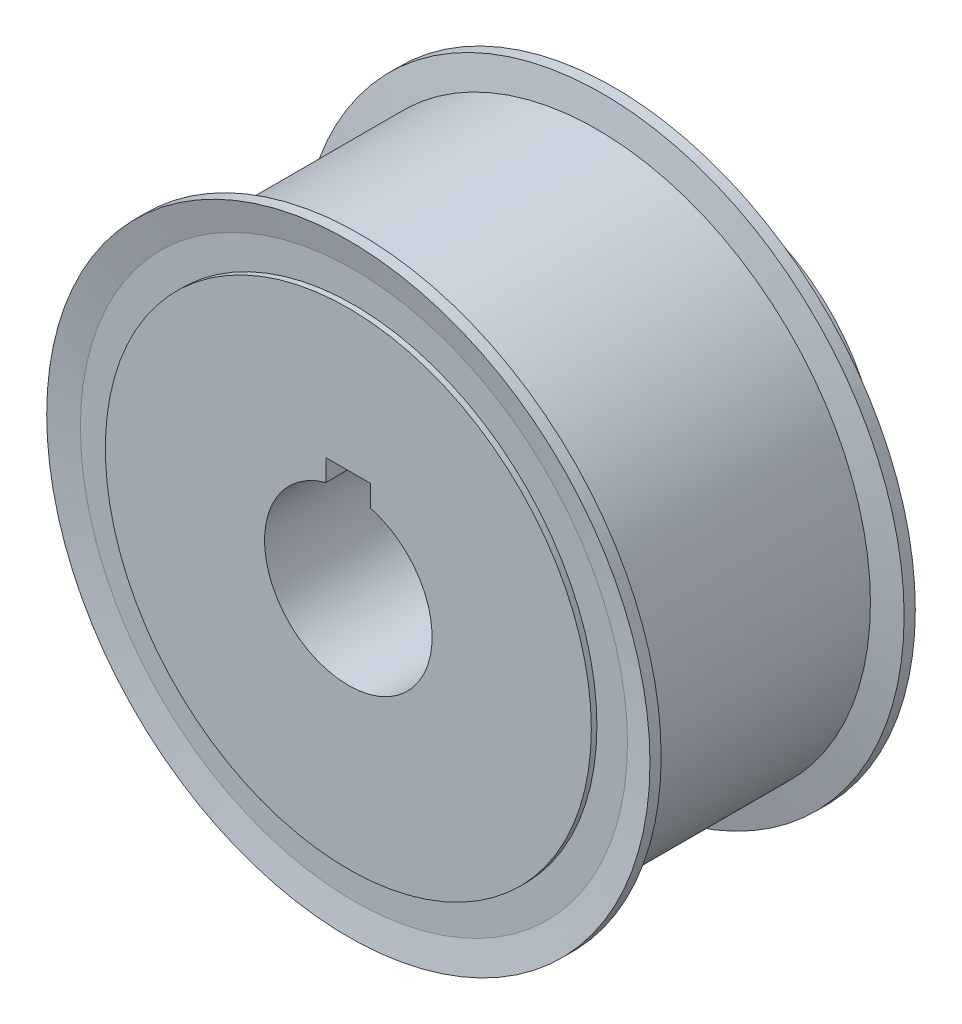
ISO-10303-21;
HEADER;
FILE_DESCRIPTION(('STEP AP214'),'2;1');
FILE_NAME('part.step','',(''),(''),'','','');
FILE_SCHEMA(('AUTOMOTIVE_DESIGN { 1 0 10303 214 1 1 1 1 }'));
ENDSEC;
DATA;
#1=APPLICATION_CONTEXT('core data for automotive mechanical design processes');
#2=APPLICATION_PROTOCOL_DEFINITION('international standard','automotive_design',2000,#1);
#3=PRODUCT_CONTEXT('',#1,'mechanical');
#4=PRODUCT('Part','Part','',(#3));
#5=PRODUCT_RELATED_PRODUCT_CATEGORY('part','',(#4));
#6=PRODUCT_DEFINITION_FORMATION('','',#4);
#7=PRODUCT_DEFINITION_CONTEXT('part definition',#1,'design');
#8=PRODUCT_DEFINITION('design','',#6,#7);
#9=PRODUCT_DEFINITION_SHAPE('','',#8);
#10=(LENGTH_UNIT() NAMED_UNIT(*) SI_UNIT(.MILLI.,.METRE.));
#11=(NAMED_UNIT(*) PLANE_ANGLE_UNIT() SI_UNIT($,.RADIAN.));
#12=(NAMED_UNIT(*) SI_UNIT($,.STERADIAN.) SOLID_ANGLE_UNIT());
#13=UNCERTAINTY_MEASURE_WITH_UNIT(LENGTH_MEASURE(1.E-05),#10,'distance_accuracy_value','');
#14=(GEOMETRIC_REPRESENTATION_CONTEXT(3) GLOBAL_UNCERTAINTY_ASSIGNED_CONTEXT((#13)) GLOBAL_UNIT_ASSIGNED_CONTEXT((#10,
#11,#12)) REPRESENTATION_CONTEXT('',''));
#15=CARTESIAN_POINT('',(0.,0.,0.));
#16=DIRECTION('',(0.,0.,1.));
#17=DIRECTION('',(1.,0.,0.));
#18=AXIS2_PLACEMENT_3D('',#15,#16,#17);
#19=CARTESIAN_POINT('',(0.,43.5,65.));
#20=DIRECTION('',(0.,0.,-1.));
#21=DIRECTION('',(-1.,0.,0.));
#22=AXIS2_PLACEMENT_3D('',#19,#20,#21);
#23=PLANE('',#22);
#24=CARTESIAN_POINT('',(0.,0.,65.));
#25=DIRECTION('',(0.,0.,-1.));
#26=DIRECTION('',(-1.,0.,0.));
#27=AXIS2_PLACEMENT_3D('',#24,#25,#26);
#28=CIRCLE('',#27,15.);
#29=CARTESIAN_POINT('',(4.,14.456832294801,65.));
#30=VERTEX_POINT('',#29);
#31=CARTESIAN_POINT('',(-4.,14.456832294801,65.));
#32=VERTEX_POINT('',#31);
#33=EDGE_CURVE('E97',#30,#32,#28,.T.);
#34=ORIENTED_EDGE('',*,*,#33,.T.);
#35=DIRECTION('',(0.,-1.,0.));
#36=VECTOR('',#35,1.);
#37=CARTESIAN_POINT('',(-4.,18.3,65.));
#38=LINE('',#37,#36);
#39=CARTESIAN_POINT('',(-4.,18.3,65.));
#40=VERTEX_POINT('',#39);
#41=EDGE_CURVE('E80',#40,#32,#38,.T.);
#42=ORIENTED_EDGE('',*,*,#41,.F.);
#43=DIRECTION('',(-1.,0.,0.));
#44=VECTOR('',#43,1.);
#45=CARTESIAN_POINT('',(-4.,18.3,65.));
#46=LINE('',#45,#44);
#47=CARTESIAN_POINT('',(4.,18.3,65.));
#48=VERTEX_POINT('',#47);
#49=EDGE_CURVE('E93',#48,#40,#46,.T.);
#50=ORIENTED_EDGE('',*,*,#49,.F.);
#51=DIRECTION('',(0.,1.,0.));
#52=VECTOR('',#51,1.);
#53=CARTESIAN_POINT('',(4.,18.3,65.));
#54=LINE('',#53,#52);
#55=EDGE_CURVE('E400',#30,#48,#54,.T.);
#56=ORIENTED_EDGE('',*,*,#55,.F.);
#57=EDGE_LOOP('',(#34,#42,#50,#56));
#58=FACE_BOUND('',#57,.T.);
#59=CARTESIAN_POINT('',(0.,0.,65.));
#60=DIRECTION('',(0.,0.,1.));
#61=DIRECTION('',(1.,0.,0.));
#62=AXIS2_PLACEMENT_3D('',#59,#60,#61);
#63=CIRCLE('',#62,43.5);
#64=CARTESIAN_POINT('',(43.5,0.,65.));
#65=VERTEX_POINT('',#64);
#66=EDGE_CURVE('E96',#65,#65,#63,.T.);
#67=ORIENTED_EDGE('',*,*,#66,.T.);
#68=EDGE_LOOP('',(#67));
#69=FACE_BOUND('',#68,.T.);
#70=ADVANCED_FACE('F34',(#58,#69),#23,.F.);
#71=CARTESIAN_POINT('',(0.,30.,0.));
#72=DIRECTION('',(0.,0.,1.));
#73=DIRECTION('',(1.,0.,0.));
#74=AXIS2_PLACEMENT_3D('',#71,#72,#73);
#75=PLANE('',#74);
#76=DIRECTION('',(-1.,0.,0.));
#77=VECTOR('',#76,1.);
#78=CARTESIAN_POINT('',(-4.,18.3,0.));
#79=LINE('',#78,#77);
#80=CARTESIAN_POINT('',(4.,18.3,0.));
#81=VERTEX_POINT('',#80);
#82=CARTESIAN_POINT('',(-4.,18.3,0.));
#83=VERTEX_POINT('',#82);
#84=EDGE_CURVE('E86',#81,#83,#79,.T.);
#85=ORIENTED_EDGE('',*,*,#84,.T.);
#86=DIRECTION('',(0.,-1.,0.));
#87=VECTOR('',#86,1.);
#88=CARTESIAN_POINT('',(-4.,18.3,0.));
#89=LINE('',#88,#87);
#90=CARTESIAN_POINT('',(-4.,14.456832294801,0.));
#91=VERTEX_POINT('',#90);
#92=EDGE_CURVE('E77',#83,#91,#89,.T.);
#93=ORIENTED_EDGE('',*,*,#92,.T.);
#94=CARTESIAN_POINT('',(0.,0.,0.));
#95=DIRECTION('',(0.,0.,-1.));
#96=DIRECTION('',(-1.,0.,0.));
#97=AXIS2_PLACEMENT_3D('',#94,#95,#96);
#98=CIRCLE('',#97,15.);
#99=CARTESIAN_POINT('',(4.,14.456832294801,0.));
#100=VERTEX_POINT('',#99);
#101=EDGE_CURVE('E92',#100,#91,#98,.T.);
#102=ORIENTED_EDGE('',*,*,#101,.F.);
#103=DIRECTION('',(0.,1.,0.));
#104=VECTOR('',#103,1.);
#105=CARTESIAN_POINT('',(4.,18.3,0.));
#106=LINE('',#105,#104);
#107=EDGE_CURVE('E48',#100,#81,#106,.T.);
#108=ORIENTED_EDGE('',*,*,#107,.T.);
#109=EDGE_LOOP('',(#85,#93,#102,#108));
#110=FACE_BOUND('',#109,.T.);
#111=CARTESIAN_POINT('',(0.,0.,0.));
#112=DIRECTION('',(0.,0.,1.));
#113=DIRECTION('',(1.,0.,0.));
#114=AXIS2_PLACEMENT_3D('',#111,#112,#113);
#115=CIRCLE('',#114,30.);
#116=CARTESIAN_POINT('',(30.,0.,0.));
#117=VERTEX_POINT('',#116);
#118=EDGE_CURVE('E11',#117,#117,#115,.T.);
#119=ORIENTED_EDGE('',*,*,#118,.F.);
#120=EDGE_LOOP('',(#119));
#121=FACE_BOUND('',#120,.T.);
#122=ADVANCED_FACE('F90',(#110,#121),#75,.F.);
#123=CARTESIAN_POINT('',(0.,0.,66.1429183979645));
#124=DIRECTION('',(0.,0.,1.));
#125=DIRECTION('',(1.,0.,0.));
#126=AXIS2_PLACEMENT_3D('',#123,#124,#125);
#127=CYLINDRICAL_SURFACE('',#126,30.);
#128=CARTESIAN_POINT('',(-24.6403939715099,-17.112889438338,8.));
#129=CARTESIAN_POINT('',(-24.6403982302135,-17.1128848269579,7.85983572802399));
#130=CARTESIAN_POINT('',(-24.6471704638801,-17.1031448928795,7.7195760346058));
#131=CARTESIAN_POINT('',(-24.6740153601059,-17.064392757025,7.44293744914142));
#132=CARTESIAN_POINT('',(-24.6941030931281,-17.035358718115,7.30656313718097));
#133=CARTESIAN_POINT('',(-24.7467822248692,-16.9587416374846,7.04174200968668));
#134=CARTESIAN_POINT('',(-24.7793665348156,-16.9111691116075,6.91329074761262));
#135=CARTESIAN_POINT('',(-24.85577810676,-16.7986575925144,6.66789201197522));
#136=CARTESIAN_POINT('',(-24.8996029650876,-16.7337223120106,6.5509420863624));
#137=CARTESIAN_POINT('',(-24.9969732573213,-16.5879175218532,6.33153499233339));
#138=CARTESIAN_POINT('',(-25.0505405914615,-16.5070120769735,6.22911142034259));
#139=CARTESIAN_POINT('',(-25.1653893889673,-16.3313858165926,6.04195308440494));
#140=CARTESIAN_POINT('',(-25.2266711891753,-16.2366643978055,5.95721909328104));
#141=CARTESIAN_POINT('',(-25.3549008499011,-16.0356855324758,5.80773346335955));
#142=CARTESIAN_POINT('',(-25.4218567742758,-15.9294116052125,5.74301089204638));
#143=CARTESIAN_POINT('',(-25.5591069750862,-15.708245311677,5.63557127220377));
#144=CARTESIAN_POINT('',(-25.629401193066,-15.5933530962965,5.59285383850449));
#145=CARTESIAN_POINT('',(-25.7709089460739,-15.3583531208021,5.53073379035992));
#146=CARTESIAN_POINT('',(-25.8421199433262,-15.2382582018677,5.51127682220139));
#147=CARTESIAN_POINT('',(-25.983473518509,-14.9959585455332,5.49606199203853));
#148=CARTESIAN_POINT('',(-26.0536161162836,-14.8737538474094,5.50030368932525));
#149=CARTESIAN_POINT('',(-26.1906866088721,-14.6310395402593,5.53232133044844));
#150=CARTESIAN_POINT('',(-26.2576220518945,-14.5105264763043,5.56003882451051));
#151=CARTESIAN_POINT('',(-26.3867358879054,-14.2743927889778,5.63813037740523));
#152=CARTESIAN_POINT('',(-26.4489142356258,-14.1587722121675,5.68850465180638));
#153=CARTESIAN_POINT('',(-26.567123329231,-13.9357069784381,5.81054496779643));
#154=CARTESIAN_POINT('',(-26.6231464003121,-13.8282725785832,5.88223718649691));
#155=CARTESIAN_POINT('',(-26.7277634622212,-13.6249679742124,6.04485930394655));
#156=CARTESIAN_POINT('',(-26.7763573023229,-13.5290980043274,6.13578959291404));
#157=CARTESIAN_POINT('',(-26.8653148537188,-13.3515829493876,6.33463609988813));
#158=CARTESIAN_POINT('',(-26.9056531003474,-13.2699819870085,6.44260310704702));
#159=CARTESIAN_POINT('',(-26.9772015087608,-13.1239184294215,6.67228126279082));
#160=CARTESIAN_POINT('',(-27.008411663021,-13.0594558483414,6.79399242270543));
#161=CARTESIAN_POINT('',(-27.0611983817954,-12.9497207938789,7.0477397194295));
#162=CARTESIAN_POINT('',(-27.0827737580987,-12.9044506874471,7.17977712736724));
#163=CARTESIAN_POINT('',(-27.1159524315456,-12.8345873569412,7.45041179512749));
#164=CARTESIAN_POINT('',(-27.127555938337,-12.8099936981675,7.5890089169745));
#165=CARTESIAN_POINT('',(-27.1405994256434,-12.7823354917377,7.86838296638824));
#166=CARTESIAN_POINT('',(-27.1420698377026,-12.7792064819284,8.00915209361722));
#167=CARTESIAN_POINT('',(-27.1349063953962,-12.794409825239,8.28926585912408));
#168=CARTESIAN_POINT('',(-27.1262726352762,-12.8127419781823,8.42861051067636));
#169=CARTESIAN_POINT('',(-27.0990476088525,-12.8702221119769,8.70171588949886));
#170=CARTESIAN_POINT('',(-27.0804706920047,-12.9093400951915,8.83548436490773));
#171=CARTESIAN_POINT('',(-27.0336483237271,-13.0071049383361,9.09388020540935));
#172=CARTESIAN_POINT('',(-27.0054027171595,-13.065752111619,9.21850742378818));
#173=CARTESIAN_POINT('',(-26.939612292623,-13.2008684461292,9.45540813054815));
#174=CARTESIAN_POINT('',(-26.9020455449169,-13.2773796103424,9.56765157099605));
#175=CARTESIAN_POINT('',(-26.8182898467976,-13.4457483019269,9.77629485226708));
#176=CARTESIAN_POINT('',(-26.7721007480168,-13.5376060933699,9.87269442040579));
#177=CARTESIAN_POINT('',(-26.6718404221128,-13.7340853129728,10.0471560144251));
#178=CARTESIAN_POINT('',(-26.6177498956843,-13.8387378874174,10.1251718825078));
#179=CARTESIAN_POINT('',(-26.5028989517259,-14.0574386612997,10.2603347839114));
#180=CARTESIAN_POINT('',(-26.4421386008553,-14.1714867668341,10.3174820257718));
#181=CARTESIAN_POINT('',(-26.3154294502587,-14.4054097301251,10.4092062060402));
#182=CARTESIAN_POINT('',(-26.2494873310264,-14.5252770117849,10.4438116878646));
#183=CARTESIAN_POINT('',(-26.1140193283849,-14.7674382998933,10.4895633143852));
#184=CARTESIAN_POINT('',(-26.044493512836,-14.8897322603636,10.5007099031289));
#185=CARTESIAN_POINT('',(-25.9039909318507,-15.1328419809002,10.4992221509976));
#186=CARTESIAN_POINT('',(-25.8330191996334,-15.2536610965669,10.4866597454036));
#187=CARTESIAN_POINT('',(-25.6915139286287,-15.4908097220287,10.4382606137211));
#188=CARTESIAN_POINT('',(-25.6209803904365,-15.6071392257257,10.4024238560207));
#189=CARTESIAN_POINT('',(-25.4825632424881,-15.8321328421203,10.3085115746941));
#190=CARTESIAN_POINT('',(-25.4146794790054,-15.9407973997951,10.2504373432926));
#191=CARTESIAN_POINT('',(-25.2837898036293,-16.1475994502618,10.1137068865058));
#192=CARTESIAN_POINT('',(-25.2207838146183,-16.2457371094929,10.035050986602));
#193=CARTESIAN_POINT('',(-25.1016360662934,-16.429238905158,9.85911996287728));
#194=CARTESIAN_POINT('',(-25.0455147006059,-16.5145652515114,9.76179161163362));
#195=CARTESIAN_POINT('',(-24.94234887553,-16.6699717364843,9.55137457818509));
#196=CARTESIAN_POINT('',(-24.8953066177123,-16.7400481777153,9.43828208479276));
#197=CARTESIAN_POINT('',(-24.8119862322521,-16.8633004294738,9.19932749824763));
#198=CARTESIAN_POINT('',(-24.7757284391683,-16.9164443262417,9.07344187499691));
#199=CARTESIAN_POINT('',(-24.7155235583936,-17.0042864414597,8.81273140816347));
#200=CARTESIAN_POINT('',(-24.6915623179023,-17.039005867255,8.67791704395692));
#201=CARTESIAN_POINT('',(-24.6629898108688,-17.0803189904249,8.45192278943201));
#202=CARTESIAN_POINT('',(-24.65453111942,-17.0925186838292,8.36219636805358));
#203=CARTESIAN_POINT('',(-24.6432318271109,-17.1088053913604,8.18165999206287));
#204=CARTESIAN_POINT('',(-24.6403912111531,-17.1128924272884,8.09085004036301));
#205=CARTESIAN_POINT('',(-24.6403939715099,-17.112889438338,8.));
#206=B_SPLINE_CURVE_WITH_KNOTS('',3,(#128,#129,#130,#131,#132,#133,#134,#135,#136,#137,#138,
#139,#140,#141,#142,#143,#144,#145,#146,#147,#148,#149,#150,#151,#152,#153,#154,#155,#156,#157,
#158,#159,#160,#161,#162,#163,#164,#165,#166,#167,#168,#169,#170,#171,#172,#173,#174,#175,#176,
#177,#178,#179,#180,#181,#182,#183,#184,#185,#186,#187,#188,#189,#190,#191,#192,#193,#194,#195,
#196,#197,#198,#199,#200,#201,#202,#203,#204,#205),.UNSPECIFIED.,.T.,.F.,(4,2,2,2,2,2,2,2,2,2,2,
2,2,2,2,2,2,2,2,2,2,2,2,2,2,2,2,2,2,2,2,2,2,2,2,2,2,2,4),(0.,0.420161105126485,
0.840798561792929,1.26119776094298,1.68150713708956,2.10277327972936,2.52405782280751,
2.94595145651179,3.36783770529443,3.78873617555056,4.2096268186526,4.62947260311707,
5.04932238229937,5.46968985502511,5.89006585515617,6.31171960057012,6.73337369356764,
7.15507977278699,7.57677698587605,7.99720721074765,8.41763351413367,8.83745470924513,
9.2572826408636,9.67810782107509,10.0989402432321,10.5208182934246,10.9426921276865,
11.3640307220251,11.7853613408798,12.2054156584348,12.6254705465199,13.0455010288207,
13.4655248690967,13.8867643080923,14.3081057644345,14.7302367134679,15.1518807121846,
15.4242165606899,15.6965516773468),.UNSPECIFIED.);
#207=CARTESIAN_POINT('',(-24.6403939715099,-17.112889438338,8.));
#208=VERTEX_POINT('',#207);
#209=EDGE_CURVE('E162',#208,#208,#206,.T.);
#210=ORIENTED_EDGE('',*,*,#209,.T.);
#211=EDGE_LOOP('',(#210));
#212=FACE_BOUND('',#211,.T.);
#213=CARTESIAN_POINT('',(0.,30.,10.5));
#214=CARTESIAN_POINT('',(-0.14016522480301,29.9999986352879,10.4999938779343));
#215=CARTESIAN_POINT('',(-0.280425867950563,29.9990072135849,10.4881725754724));
#216=CARTESIAN_POINT('',(-0.557066426750972,29.9951475582062,10.4411891203623));
#217=CARTESIAN_POINT('',(-0.693441763063073,29.9922771982924,10.4060005242377));
#218=CARTESIAN_POINT('',(-0.958265056285649,29.9849840311526,10.3133071154766));
#219=CARTESIAN_POINT('',(-1.08671745106153,29.9805621024621,10.2558149297254));
#220=CARTESIAN_POINT('',(-1.33211808354019,29.9706616936178,10.12016892032));
#221=CARTESIAN_POINT('',(-1.44906877471347,29.9651834395339,10.0420195163062));
#222=CARTESIAN_POINT('',(-1.66847499991397,29.9537694966678,9.867062333485));
#223=CARTESIAN_POINT('',(-1.7708971810404,29.9478328021644,9.77021279016077));
#224=CARTESIAN_POINT('',(-1.95805283384138,29.9361795200792,9.56069276037516));
#225=CARTESIAN_POINT('',(-2.04278552842876,29.930462942176,9.44802157924344));
#226=CARTESIAN_POINT('',(-2.19226980597556,29.9198863165311,9.20985470725242));
#227=CARTESIAN_POINT('',(-2.25699208237885,29.9150275295023,9.08434056149306));
#228=CARTESIAN_POINT('',(-2.3644310844346,29.9067281112068,8.82417926111004));
#229=CARTESIAN_POINT('',(-2.40714819878103,29.9032874548908,8.68953226785437));
#230=CARTESIAN_POINT('',(-2.46926757454642,29.898222301658,8.41526152029705));
#231=CARTESIAN_POINT('',(-2.48872416347443,29.8965935734055,8.27565015001849));
#232=CARTESIAN_POINT('',(-2.50393802003856,29.8953233080369,7.99513449013658));
#233=CARTESIAN_POINT('',(-2.49969573244884,29.8956817336265,7.85423022484749));
#234=CARTESIAN_POINT('',(-2.46767716053711,29.8983414340409,7.5755008362237));
#235=CARTESIAN_POINT('',(-2.43995992009513,29.9006378344463,7.43766887730897));
#236=CARTESIAN_POINT('',(-2.36186996345734,29.9069070892341,7.16862033151762));
#237=CARTESIAN_POINT('',(-2.31149702599195,29.91087995999,7.03740380926537));
#238=CARTESIAN_POINT('',(-2.18945947038007,29.9200601176713,6.78512273530476));
#239=CARTESIAN_POINT('',(-2.11776836189298,29.9252689387741,6.66407105603123));
#240=CARTESIAN_POINT('',(-1.95514860978336,29.936332671597,6.43569665295049));
#241=CARTESIAN_POINT('',(-1.86421957655635,29.9421875964008,6.32837420725697));
#242=CARTESIAN_POINT('',(-1.6653739555659,29.9539055102911,6.13016145179609));
#243=CARTESIAN_POINT('',(-1.55740632347643,29.9597684693766,6.03932233967688));
#244=CARTESIAN_POINT('',(-1.32772639092937,29.9708247967459,5.87705069152863));
#245=CARTESIAN_POINT('',(-1.20601408128834,29.9760181645821,5.80561816846612));
#246=CARTESIAN_POINT('',(-0.952266483169624,29.985151145241,5.68419059332825));
#247=CARTESIAN_POINT('',(-0.820230104522682,29.9890906254361,5.63419780880462));
#248=CARTESIAN_POINT('',(-0.549597672548952,29.995270435295,5.55710466887169));
#249=CARTESIAN_POINT('',(-0.411001755422135,29.9975108002221,5.53000383836185));
#250=CARTESIAN_POINT('',(-0.131628250410626,30.0000354235763,5.49952808989606));
#251=CARTESIAN_POINT('',(0.00914157278799105,30.0003255123,5.49608245473277));
#252=CARTESIAN_POINT('',(0.289256881258258,29.9989324694675,5.5128296515683));
#253=CARTESIAN_POINT('',(0.428602379803532,29.9972493563169,5.53302226307366));
#254=CARTESIAN_POINT('',(0.701711890561746,29.992102946033,5.59641414652525));
#255=CARTESIAN_POINT('',(0.835483562849302,29.9886421854355,5.63958064006454));
#256=CARTESIAN_POINT('',(1.09388541270622,29.9803292528088,5.74766146945508));
#257=CARTESIAN_POINT('',(1.21851544570783,29.9754770587811,5.81257614914626));
#258=CARTESIAN_POINT('',(1.45541804575476,29.9649106598408,5.9624883730409));
#259=CARTESIAN_POINT('',(1.56766087630367,29.9591944554684,6.04753276598708));
#260=CARTESIAN_POINT('',(1.77630273710904,29.9475489659924,6.23522264262621));
#261=CARTESIAN_POINT('',(1.87270149203595,29.9416196771882,6.33786843212317));
#262=CARTESIAN_POINT('',(2.04716136363775,29.9301990303955,6.55815423049585));
#263=CARTESIAN_POINT('',(2.12517633308409,29.9247087968556,6.67583085299351));
#264=CARTESIAN_POINT('',(2.26033765709878,29.914803793608,6.92265565715854));
#265=CARTESIAN_POINT('',(2.3174842200249,29.9103890131629,7.05180372427485));
#266=CARTESIAN_POINT('',(2.4092079436014,29.9031410712235,7.3177419763481));
#267=CARTESIAN_POINT('',(2.44381335362321,29.9003059307159,7.45452236178583));
#268=CARTESIAN_POINT('',(2.48956442477537,29.8965316422713,7.73197674968606));
#269=CARTESIAN_POINT('',(2.50071053642066,29.8955924579242,7.87265067732399));
#270=CARTESIAN_POINT('',(2.49922140722732,29.8957169487549,8.15344031505224));
#271=CARTESIAN_POINT('',(2.48665867444347,29.8967745173267,8.29355641809109));
#272=CARTESIAN_POINT('',(2.43825965823756,29.9007603770577,8.56968133387713));
#273=CARTESIAN_POINT('',(2.40242333931906,29.9036886710699,8.7056901403596));
#274=CARTESIAN_POINT('',(2.30851277504265,29.9110844282926,8.96974440816654));
#275=CARTESIAN_POINT('',(2.25043983501632,29.9155518011547,9.09779033641422));
#276=CARTESIAN_POINT('',(2.11371264736812,29.9255224968767,9.34232710143417));
#277=CARTESIAN_POINT('',(2.03505872278639,29.9310258034762,9.45881811953331));
#278=CARTESIAN_POINT('',(1.85912985530611,29.942468292467,9.67730934753252));
#279=CARTESIAN_POINT('',(1.76180123435364,29.9484087001436,9.77926627164336));
#280=CARTESIAN_POINT('',(1.55138306398116,29.960044875242,9.96543796300829));
#281=CARTESIAN_POINT('',(1.43828970660272,29.9657405831206,10.04964843124));
#282=CARTESIAN_POINT('',(1.19933443257353,29.9762558710569,10.1980496510439));
#283=CARTESIAN_POINT('',(1.07344914067634,29.9810738005776,10.2622028466408));
#284=CARTESIAN_POINT('',(0.81273937998933,29.9892713129075,10.3683795076282));
#285=CARTESIAN_POINT('',(0.677925388534124,29.9926525482064,10.4104284107203));
#286=CARTESIAN_POINT('',(0.451930120241696,29.9967276933463,10.4604939562551));
#287=CARTESIAN_POINT('',(0.362202236096174,29.9979492219238,10.4752890312937));
#288=CARTESIAN_POINT('',(0.181662928752905,29.9995858164658,10.495044024193));
#289=CARTESIAN_POINT('',(0.0908515084326119,30.0000008845714,10.5000039681662));
#290=CARTESIAN_POINT('',(0.,30.,10.5));
#291=B_SPLINE_CURVE_WITH_KNOTS('',3,(#213,#214,#215,#216,#217,#218,#219,#220,#221,#222,#223,
#224,#225,#226,#227,#228,#229,#230,#231,#232,#233,#234,#235,#236,#237,#238,#239,#240,#241,#242,
#243,#244,#245,#246,#247,#248,#249,#250,#251,#252,#253,#254,#255,#256,#257,#258,#259,#260,#261,
#262,#263,#264,#265,#266,#267,#268,#269,#270,#271,#272,#273,#274,#275,#276,#277,#278,#279,#280,
#281,#282,#283,#284,#285,#286,#287,#288,#289,#290),.UNSPECIFIED.,.T.,.F.,(4,2,2,2,2,2,2,2,2,2,2,
2,2,2,2,2,2,2,2,2,2,2,2,2,2,2,2,2,2,2,2,2,2,2,2,2,2,2,4),(0.,0.420163967000346,
0.840804222494585,1.26120668472238,1.68151927396045,2.10278167196441,2.52406257184828,
2.94595757377728,3.36784512319751,3.78874537078964,4.20963771906546,4.62947457775722,
5.04931553692495,5.46968039372246,5.89005376452148,6.31171127337871,6.73336906396609,
7.15507143976123,7.57676506331334,7.99719748267918,8.41762598035549,8.8374562257696,
9.25729310903427,9.67811687437313,10.0989479517812,10.52082441228,10.9426966604957,
11.3640391810232,11.7853736099689,12.2054215720631,12.6254701748084,13.045494123688,
13.4655114802463,13.8867547166159,14.308099880812,14.7302293265638,15.1518719147946,
15.4242121589165,15.6965516799686),.UNSPECIFIED.);
#292=CARTESIAN_POINT('',(0.,30.,10.5));
#293=VERTEX_POINT('',#292);
#294=EDGE_CURVE('E156',#293,#293,#291,.T.);
#295=ORIENTED_EDGE('',*,*,#294,.T.);
#296=EDGE_LOOP('',(#295));
#297=FACE_BOUND('',#296,.T.);
#298=CARTESIAN_POINT('',(0.,0.,17.5));
#299=DIRECTION('',(0.,0.,1.));
#300=DIRECTION('',(1.,0.,0.));
#301=AXIS2_PLACEMENT_3D('',#298,#299,#300);
#302=CIRCLE('',#301,30.);
#303=CARTESIAN_POINT('',(30.,0.,17.5));
#304=VERTEX_POINT('',#303);
#305=EDGE_CURVE('E41',#304,#304,#302,.T.);
#306=ORIENTED_EDGE('',*,*,#305,.F.);
#307=EDGE_LOOP('',(#306));
#308=FACE_BOUND('',#307,.T.);
#309=ORIENTED_EDGE('',*,*,#118,.T.);
#310=EDGE_LOOP('',(#309));
#311=FACE_BOUND('',#310,.T.);
#312=ADVANCED_FACE('F140',(#212,#297,#308,#311),#127,.T.);
#313=CARTESIAN_POINT('',(0.,43.5,17.5));
#314=DIRECTION('',(0.,0.,1.));
#315=DIRECTION('',(1.,0.,0.));
#316=AXIS2_PLACEMENT_3D('',#313,#314,#315);
#317=PLANE('',#316);
#318=CARTESIAN_POINT('',(0.,0.,17.5));
#319=DIRECTION('',(0.,0.,1.));
#320=DIRECTION('',(1.,0.,0.));
#321=AXIS2_PLACEMENT_3D('',#318,#319,#320);
#322=CIRCLE('',#321,43.5);
#323=CARTESIAN_POINT('',(43.5,0.,17.5));
#324=VERTEX_POINT('',#323);
#325=EDGE_CURVE('E133',#324,#324,#322,.T.);
#326=ORIENTED_EDGE('',*,*,#325,.F.);
#327=EDGE_LOOP('',(#326));
#328=FACE_BOUND('',#327,.T.);
#329=ORIENTED_EDGE('',*,*,#305,.T.);
#330=EDGE_LOOP('',(#329));
#331=FACE_BOUND('',#330,.T.);
#332=ADVANCED_FACE('F138',(#328,#331),#317,.F.);
#333=CARTESIAN_POINT('',(0.,0.,66.1429183979645));
#334=DIRECTION('',(0.,0.,1.));
#335=DIRECTION('',(1.,0.,0.));
#336=AXIS2_PLACEMENT_3D('',#333,#334,#335);
#337=CYLINDRICAL_SURFACE('',#336,43.5);
#338=CARTESIAN_POINT('',(0.,0.,18.5));
#339=DIRECTION('',(0.,0.,1.));
#340=DIRECTION('',(1.,0.,0.));
#341=AXIS2_PLACEMENT_3D('',#338,#339,#340);
#342=CIRCLE('',#341,43.5);
#343=CARTESIAN_POINT('',(43.5,0.,18.5));
#344=VERTEX_POINT('',#343);
#345=EDGE_CURVE('E130',#344,#344,#342,.T.);
#346=ORIENTED_EDGE('',*,*,#345,.F.);
#347=EDGE_LOOP('',(#346));
#348=FACE_BOUND('',#347,.T.);
#349=ORIENTED_EDGE('',*,*,#325,.T.);
#350=EDGE_LOOP('',(#349));
#351=FACE_BOUND('',#350,.T.);
#352=ADVANCED_FACE('F234',(#348,#351),#337,.T.);
#353=CARTESIAN_POINT('',(0.,48.965,18.5));
#354=DIRECTION('',(0.,0.,1.));
#355=DIRECTION('',(1.,0.,0.));
#356=AXIS2_PLACEMENT_3D('',#353,#354,#355);
#357=PLANE('',#356);
#358=CARTESIAN_POINT('',(0.,0.,18.5));
#359=DIRECTION('',(0.,0.,1.));
#360=DIRECTION('',(1.,0.,0.));
#361=AXIS2_PLACEMENT_3D('',#358,#359,#360);
#362=CIRCLE('',#361,48.965);
#363=CARTESIAN_POINT('',(48.965,0.,18.5));
#364=VERTEX_POINT('',#363);
#365=EDGE_CURVE('E127',#364,#364,#362,.T.);
#366=ORIENTED_EDGE('',*,*,#365,.F.);
#367=EDGE_LOOP('',(#366));
#368=FACE_BOUND('',#367,.T.);
#369=ORIENTED_EDGE('',*,*,#345,.T.);
#370=EDGE_LOOP('',(#369));
#371=FACE_BOUND('',#370,.T.);
#372=ADVANCED_FACE('F231',(#368,#371),#357,.F.);
#373=CARTESIAN_POINT('',(0.,0.,18.5));
#374=DIRECTION('',(0.,0.,-1.));
#375=DIRECTION('',(-1.,0.,0.));
#376=AXIS2_PLACEMENT_3D('',#373,#374,#375);
#377=CONICAL_SURFACE('',#376,48.965,1.37473791992077);
#378=CARTESIAN_POINT('',(0.,0.,17.5));
#379=DIRECTION('',(0.,0.,1.));
#380=DIRECTION('',(1.,0.,0.));
#381=AXIS2_PLACEMENT_3D('',#378,#379,#380);
#382=CIRCLE('',#381,54.);
#383=CARTESIAN_POINT('',(54.,0.,17.5));
#384=VERTEX_POINT('',#383);
#385=EDGE_CURVE('E124',#384,#384,#382,.T.);
#386=ORIENTED_EDGE('',*,*,#385,.F.);
#387=EDGE_LOOP('',(#386));
#388=FACE_BOUND('',#387,.T.);
#389=ORIENTED_EDGE('',*,*,#365,.T.);
#390=EDGE_LOOP('',(#389));
#391=FACE_BOUND('',#390,.T.);
#392=ADVANCED_FACE('F227',(#388,#391),#377,.F.);
#393=CARTESIAN_POINT('',(0.,0.,66.1429183979645));
#394=DIRECTION('',(0.,0.,1.));
#395=DIRECTION('',(1.,0.,0.));
#396=AXIS2_PLACEMENT_3D('',#393,#394,#395);
#397=CYLINDRICAL_SURFACE('',#396,54.);
#398=CARTESIAN_POINT('',(0.,0.,19.5));
#399=DIRECTION('',(0.,0.,1.));
#400=DIRECTION('',(1.,0.,0.));
#401=AXIS2_PLACEMENT_3D('',#398,#399,#400);
#402=CIRCLE('',#401,54.);
#403=CARTESIAN_POINT('',(54.,0.,19.5));
#404=VERTEX_POINT('',#403);
#405=EDGE_CURVE('E121',#404,#404,#402,.T.);
#406=ORIENTED_EDGE('',*,*,#405,.F.);
#407=EDGE_LOOP('',(#406));
#408=FACE_BOUND('',#407,.T.);
#409=ORIENTED_EDGE('',*,*,#385,.T.);
#410=EDGE_LOOP('',(#409));
#411=FACE_BOUND('',#410,.T.);
#412=ADVANCED_FACE('F223',(#408,#411),#397,.T.);
#413=CARTESIAN_POINT('',(0.,0.,19.5));
#414=DIRECTION('',(0.,0.,-1.));
#415=DIRECTION('',(-1.,0.,0.));
#416=AXIS2_PLACEMENT_3D('',#413,#414,#415);
#417=CONICAL_SURFACE('',#416,54.,1.37473791992077);
#418=CARTESIAN_POINT('',(0.,0.,20.5));
#419=DIRECTION('',(0.,0.,1.));
#420=DIRECTION('',(1.,0.,0.));
#421=AXIS2_PLACEMENT_3D('',#418,#419,#420);
#422=CIRCLE('',#421,48.965);
#423=CARTESIAN_POINT('',(48.965,0.,20.5));
#424=VERTEX_POINT('',#423);
#425=EDGE_CURVE('E118',#424,#424,#422,.T.);
#426=ORIENTED_EDGE('',*,*,#425,.F.);
#427=EDGE_LOOP('',(#426));
#428=FACE_BOUND('',#427,.T.);
#429=ORIENTED_EDGE('',*,*,#405,.T.);
#430=EDGE_LOOP('',(#429));
#431=FACE_BOUND('',#430,.T.);
#432=ADVANCED_FACE('F219',(#428,#431),#417,.T.);
#433=CARTESIAN_POINT('',(0.,0.,66.1429183979645));
#434=DIRECTION('',(0.,0.,1.));
#435=DIRECTION('',(1.,0.,0.));
#436=AXIS2_PLACEMENT_3D('',#433,#434,#435);
#437=CYLINDRICAL_SURFACE('',#436,48.965);
#438=CARTESIAN_POINT('',(0.,0.,62.));
#439=DIRECTION('',(0.,0.,1.));
#440=DIRECTION('',(1.,0.,0.));
#441=AXIS2_PLACEMENT_3D('',#438,#439,#440);
#442=CIRCLE('',#441,48.965);
#443=CARTESIAN_POINT('',(48.965,0.,62.));
#444=VERTEX_POINT('',#443);
#445=EDGE_CURVE('E115',#444,#444,#442,.T.);
#446=ORIENTED_EDGE('',*,*,#445,.F.);
#447=EDGE_LOOP('',(#446));
#448=FACE_BOUND('',#447,.T.);
#449=ORIENTED_EDGE('',*,*,#425,.T.);
#450=EDGE_LOOP('',(#449));
#451=FACE_BOUND('',#450,.T.);
#452=ADVANCED_FACE('F215',(#448,#451),#437,.T.);
#453=CARTESIAN_POINT('',(0.,0.,62.));
#454=DIRECTION('',(0.,0.,1.));
#455=DIRECTION('',(1.,0.,0.));
#456=AXIS2_PLACEMENT_3D('',#453,#454,#455);
#457=CONICAL_SURFACE('',#456,48.965,1.37473791992077);
#458=CARTESIAN_POINT('',(0.,0.,63.));
#459=DIRECTION('',(0.,0.,1.));
#460=DIRECTION('',(1.,0.,0.));
#461=AXIS2_PLACEMENT_3D('',#458,#459,#460);
#462=CIRCLE('',#461,54.);
#463=CARTESIAN_POINT('',(54.,0.,63.));
#464=VERTEX_POINT('',#463);
#465=EDGE_CURVE('E112',#464,#464,#462,.T.);
#466=ORIENTED_EDGE('',*,*,#465,.F.);
#467=EDGE_LOOP('',(#466));
#468=FACE_BOUND('',#467,.T.);
#469=ORIENTED_EDGE('',*,*,#445,.T.);
#470=EDGE_LOOP('',(#469));
#471=FACE_BOUND('',#470,.T.);
#472=ADVANCED_FACE('F211',(#468,#471),#457,.T.);
#473=CARTESIAN_POINT('',(0.,0.,66.1429183979645));
#474=DIRECTION('',(0.,0.,1.));
#475=DIRECTION('',(1.,0.,0.));
#476=AXIS2_PLACEMENT_3D('',#473,#474,#475);
#477=CYLINDRICAL_SURFACE('',#476,54.);
#478=CARTESIAN_POINT('',(0.,0.,65.));
#479=DIRECTION('',(0.,0.,1.));
#480=DIRECTION('',(1.,0.,0.));
#481=AXIS2_PLACEMENT_3D('',#478,#479,#480);
#482=CIRCLE('',#481,54.);
#483=CARTESIAN_POINT('',(54.,0.,65.));
#484=VERTEX_POINT('',#483);
#485=EDGE_CURVE('E109',#484,#484,#482,.T.);
#486=ORIENTED_EDGE('',*,*,#485,.F.);
#487=EDGE_LOOP('',(#486));
#488=FACE_BOUND('',#487,.T.);
#489=ORIENTED_EDGE('',*,*,#465,.T.);
#490=EDGE_LOOP('',(#489));
#491=FACE_BOUND('',#490,.T.);
#492=ADVANCED_FACE('F207',(#488,#491),#477,.T.);
#493=CARTESIAN_POINT('',(0.,0.,65.));
#494=DIRECTION('',(0.,0.,1.));
#495=DIRECTION('',(1.,0.,0.));
#496=AXIS2_PLACEMENT_3D('',#493,#494,#495);
#497=CONICAL_SURFACE('',#496,54.,1.37473791992077);
#498=CARTESIAN_POINT('',(0.,0.,64.));
#499=DIRECTION('',(0.,0.,1.));
#500=DIRECTION('',(1.,0.,0.));
#501=AXIS2_PLACEMENT_3D('',#498,#499,#500);
#502=CIRCLE('',#501,48.965);
#503=CARTESIAN_POINT('',(48.965,0.,64.));
#504=VERTEX_POINT('',#503);
#505=EDGE_CURVE('E106',#504,#504,#502,.T.);
#506=ORIENTED_EDGE('',*,*,#505,.F.);
#507=EDGE_LOOP('',(#506));
#508=FACE_BOUND('',#507,.T.);
#509=ORIENTED_EDGE('',*,*,#485,.T.);
#510=EDGE_LOOP('',(#509));
#511=FACE_BOUND('',#510,.T.);
#512=ADVANCED_FACE('F203',(#508,#511),#497,.F.);
#513=CARTESIAN_POINT('',(0.,43.5,64.));
#514=DIRECTION('',(0.,0.,-1.));
#515=DIRECTION('',(-1.,0.,0.));
#516=AXIS2_PLACEMENT_3D('',#513,#514,#515);
#517=PLANE('',#516);
#518=CARTESIAN_POINT('',(0.,0.,64.));
#519=DIRECTION('',(0.,0.,1.));
#520=DIRECTION('',(1.,0.,0.));
#521=AXIS2_PLACEMENT_3D('',#518,#519,#520);
#522=CIRCLE('',#521,43.5);
#523=CARTESIAN_POINT('',(43.5,0.,64.));
#524=VERTEX_POINT('',#523);
#525=EDGE_CURVE('E100',#524,#524,#522,.T.);
#526=ORIENTED_EDGE('',*,*,#525,.F.);
#527=EDGE_LOOP('',(#526));
#528=FACE_BOUND('',#527,.T.);
#529=ORIENTED_EDGE('',*,*,#505,.T.);
#530=EDGE_LOOP('',(#529));
#531=FACE_BOUND('',#530,.T.);
#532=ADVANCED_FACE('F199',(#528,#531),#517,.F.);
#533=CARTESIAN_POINT('',(0.,0.,66.1429183979645));
#534=DIRECTION('',(0.,0.,1.));
#535=DIRECTION('',(1.,0.,0.));
#536=AXIS2_PLACEMENT_3D('',#533,#534,#535);
#537=CYLINDRICAL_SURFACE('',#536,43.5);
#538=ORIENTED_EDGE('',*,*,#66,.F.);
#539=EDGE_LOOP('',(#538));
#540=FACE_BOUND('',#539,.T.);
#541=ORIENTED_EDGE('',*,*,#525,.T.);
#542=EDGE_LOOP('',(#541));
#543=FACE_BOUND('',#542,.T.);
#544=ADVANCED_FACE('F195',(#540,#543),#537,.T.);
#545=CARTESIAN_POINT('',(0.,0.,-15.3565019251708));
#546=DIRECTION('',(0.,0.,-1.));
#547=DIRECTION('',(-1.,0.,0.));
#548=AXIS2_PLACEMENT_3D('',#545,#546,#547);
#549=CYLINDRICAL_SURFACE('',#548,15.);
#550=CARTESIAN_POINT('',(-11.5586884574495,-9.56016323833566,8.));
#551=CARTESIAN_POINT('',(-11.5586934370876,-9.56015964518343,8.13937574816181));
#552=CARTESIAN_POINT('',(-11.5662605331716,-9.55103095067284,8.27882760607147));
#553=CARTESIAN_POINT('',(-11.5961719394126,-9.51469017163353,8.55381854326317));
#554=CARTESIAN_POINT('',(-11.6185298771438,-9.48746141045731,8.68935389375806));
#555=CARTESIAN_POINT('',(-11.6769034958767,-9.415522057409,8.9524922833416));
#556=CARTESIAN_POINT('',(-11.7129077619605,-9.37082607559662,9.08010184866224));
#557=CARTESIAN_POINT('',(-11.7968817647607,-9.26488685459741,9.32398095471777));
#558=CARTESIAN_POINT('',(-11.8448501549197,-9.20364547752363,9.44025176957732));
#559=CARTESIAN_POINT('',(-11.9511026707005,-9.0652523909922,9.65931284974456));
#560=CARTESIAN_POINT('',(-12.0094740740623,-8.9879650781018,9.76197513138621));
#561=CARTESIAN_POINT('',(-12.1337725507181,-8.81943906804323,9.9497933068618));
#562=CARTESIAN_POINT('',(-12.1997000714662,-8.72819954455355,10.0349481631154));
#563=CARTESIAN_POINT('',(-12.3368876505731,-8.53319852159254,10.1858145672193));
#564=CARTESIAN_POINT('',(-12.4081771935301,-8.42936552013532,10.2514070077318));
#565=CARTESIAN_POINT('',(-12.5530135309662,-8.21211751540868,10.3605210705305));
#566=CARTESIAN_POINT('',(-12.6265601783466,-8.09870313573082,10.4040441278849));
#567=CARTESIAN_POINT('',(-12.7726043782978,-7.86633496629952,10.4673925349839));
#568=CARTESIAN_POINT('',(-12.8451053482362,-7.74744197049844,10.4874329160047));
#569=CARTESIAN_POINT('',(-12.9874070176447,-7.50645277371831,10.5039157541526));
#570=CARTESIAN_POINT('',(-13.0572079003297,-7.3843567910253,10.5003598152472));
#571=CARTESIAN_POINT('',(-13.191459456521,-7.14173916394855,10.4699186484718));
#572=CARTESIAN_POINT('',(-13.2559562741439,-7.02121390411934,10.4432648365908));
#573=CARTESIAN_POINT('',(-13.37886499604,-6.7840856546867,10.3677489257535));
#574=CARTESIAN_POINT('',(-13.4372767149214,-6.66748278465806,10.3188861504105));
#575=CARTESIAN_POINT('',(-13.5472061013983,-6.44120470201017,10.2001093596847));
#576=CARTESIAN_POINT('',(-13.5986909809889,-6.33156365103618,10.1300999879176));
#577=CARTESIAN_POINT('',(-13.6937877003266,-6.12317871640248,9.97108717736495));
#578=CARTESIAN_POINT('',(-13.7373989023393,-6.02443571569005,9.88208220128918));
#579=CARTESIAN_POINT('',(-13.8168823127997,-5.83986319668301,9.68632119338069));
#580=CARTESIAN_POINT('',(-13.8526542123502,-5.75420487914733,9.57936290509901));
#581=CARTESIAN_POINT('',(-13.9156493072063,-5.6001475753041,9.35141290978418));
#582=CARTESIAN_POINT('',(-13.9428724236566,-5.53174874820229,9.23042107331718));
#583=CARTESIAN_POINT('',(-13.9887966650558,-5.41456853060961,8.97760835812252));
#584=CARTESIAN_POINT('',(-14.0074882106307,-5.36580919881753,8.84577550190791));
#585=CARTESIAN_POINT('',(-14.0363507248266,-5.28985116554164,8.57515092769246));
#586=CARTESIAN_POINT('',(-14.0465224436933,-5.26265056563307,8.43635982356758));
#587=CARTESIAN_POINT('',(-14.0583190629041,-5.23105630247828,8.15753384383787));
#588=CARTESIAN_POINT('',(-14.060044589239,-5.22639412992756,8.0175336202979));
#589=CARTESIAN_POINT('',(-14.0552295215341,-5.23932905230813,7.73871332830918));
#590=CARTESIAN_POINT('',(-14.0486892467692,-5.25692528748635,7.59989321448603));
#591=CARTESIAN_POINT('',(-14.027382339455,-5.31351483996986,7.32827224080915));
#592=CARTESIAN_POINT('',(-14.0126680054073,-5.35237210340669,7.19543886012199));
#593=CARTESIAN_POINT('',(-13.9750016166558,-5.44995862420507,6.93852983372052));
#594=CARTESIAN_POINT('',(-13.9520490691492,-5.50868907035111,6.8144547124491));
#595=CARTESIAN_POINT('',(-13.8976262377438,-5.64458781957335,6.5773254055939));
#596=CARTESIAN_POINT('',(-13.8660793430247,-5.72192118810694,6.46438342724395));
#597=CARTESIAN_POINT('',(-13.7946184733469,-5.89211326673234,6.253886467305));
#598=CARTESIAN_POINT('',(-13.7547039098441,-5.98497306879029,6.15633256889027));
#599=CARTESIAN_POINT('',(-13.6662772647918,-6.18424186942241,5.9783481072713));
#600=CARTESIAN_POINT('',(-13.6176800880255,-6.29078173321424,5.89810617371546));
#601=CARTESIAN_POINT('',(-13.5127034116137,-6.51321339213462,5.75834467299513));
#602=CARTESIAN_POINT('',(-13.4563241637847,-6.62910488460771,5.69882443552616));
#603=CARTESIAN_POINT('',(-13.3369671370651,-6.86606246311842,5.60248941604514));
#604=CARTESIAN_POINT('',(-13.2740194698046,-6.98710354899232,5.56557592426509));
#605=CARTESIAN_POINT('',(-13.1426931098182,-7.23109944889524,5.51518440103618));
#606=CARTESIAN_POINT('',(-13.0743148644528,-7.35405410461852,5.50170444126766));
#607=CARTESIAN_POINT('',(-12.9348099328407,-7.59671276782965,5.49861811768781));
#608=CARTESIAN_POINT('',(-12.8637265347279,-7.71643810766321,5.50872474605892));
#609=CARTESIAN_POINT('',(-12.7201961165243,-7.95081761168616,5.55190392226944));
#610=CARTESIAN_POINT('',(-12.6477491040715,-8.06547180426811,5.58497634150968));
#611=CARTESIAN_POINT('',(-12.503994647522,-8.28658574947057,5.67303816554366));
#612=CARTESIAN_POINT('',(-12.4326860262746,-8.39305446875829,5.72800316821006));
#613=CARTESIAN_POINT('',(-12.2936770905488,-8.59538180488461,5.85825793623059));
#614=CARTESIAN_POINT('',(-12.2259769473012,-8.69123991845671,5.93354866506246));
#615=CARTESIAN_POINT('',(-12.0960143974828,-8.87124108680324,6.10333509246051));
#616=CARTESIAN_POINT('',(-12.0338231836771,-8.9552373273934,6.19804095475126));
#617=CARTESIAN_POINT('',(-11.9183067494044,-9.10841323612788,6.40352830790382));
#618=CARTESIAN_POINT('',(-11.8649836090025,-9.17758942922594,6.51431355891254));
#619=CARTESIAN_POINT('',(-11.7692105747979,-9.30009619015127,6.74974532248962));
#620=CARTESIAN_POINT('',(-11.7268402610362,-9.35331121255662,6.87448433976549));
#621=CARTESIAN_POINT('',(-11.6555022480544,-9.44206212046278,7.13360923583815));
#622=CARTESIAN_POINT('',(-11.6265211611957,-9.47761566803184,7.26798532267737));
#623=CARTESIAN_POINT('',(-11.5896451953817,-9.52264057703213,7.50240376948739));
#624=CARTESIAN_POINT('',(-11.5780653852229,-9.53669496782872,7.60102680796261));
#625=CARTESIAN_POINT('',(-11.5625852970028,-9.55545750450362,7.79975348483694));
#626=CARTESIAN_POINT('',(-11.5586848795284,-9.56016582005237,7.8998570963242));
#627=CARTESIAN_POINT('',(-11.5586884574495,-9.56016323833566,8.));
#628=B_SPLINE_CURVE_WITH_KNOTS('',3,(#550,#551,#552,#553,#554,#555,#556,#557,#558,#559,#560,
#561,#562,#563,#564,#565,#566,#567,#568,#569,#570,#571,#572,#573,#574,#575,#576,#577,#578,#579,
#580,#581,#582,#583,#584,#585,#586,#587,#588,#589,#590,#591,#592,#593,#594,#595,#596,#597,#598,
#599,#600,#601,#602,#603,#604,#605,#606,#607,#608,#609,#610,#611,#612,#613,#614,#615,#616,#617,
#618,#619,#620,#621,#622,#623,#624,#625,#626,#627),.UNSPECIFIED.,.T.,.F.,(4,2,2,2,2,2,2,2,2,2,2,
2,2,2,2,2,2,2,2,2,2,2,2,2,2,2,2,2,2,2,2,2,2,2,2,2,2,2,4),(0.,0.417761038927738,
0.835907519962966,1.25370499787518,1.67145547405273,2.09289159155714,2.51435267834446,
2.93832980111434,3.36227935111112,3.78231567472564,4.2023234465269,4.61817121164667,
5.03403164249531,5.45179604139424,5.86959426226762,6.29246123462121,6.71533210746017,
7.13867662498601,7.56198385938074,7.98023542420408,8.39847083413973,8.81406064635488,
9.22967532293571,9.64912342762699,10.0686010443069,10.4924411303538,10.9162675047669,
11.3382298441764,11.7601574591235,12.1769777626591,12.5937957321882,13.0101503983245,
13.4265248039233,13.8476699746325,14.2689137888181,14.6931372761832,15.1169356674445,
15.4171067054376,15.7172722940181),.UNSPECIFIED.);
#629=CARTESIAN_POINT('',(-11.5586884574495,-9.56016323833566,8.));
#630=VERTEX_POINT('',#629);
#631=EDGE_CURVE('E169',#630,#630,#628,.T.);
#632=ORIENTED_EDGE('',*,*,#631,.T.);
#633=EDGE_LOOP('',(#632));
#634=FACE_BOUND('',#633,.T.);
#635=ORIENTED_EDGE('',*,*,#101,.T.);
#636=DIRECTION('',(0.,0.,1.));
#637=VECTOR('',#636,1.);
#638=CARTESIAN_POINT('',(-4.,14.456832294801,0.));
#639=LINE('',#638,#637);
#640=EDGE_CURVE('E74',#91,#32,#639,.T.);
#641=ORIENTED_EDGE('',*,*,#640,.T.);
#642=ORIENTED_EDGE('',*,*,#33,.F.);
#643=DIRECTION('',(0.,0.,1.));
#644=VECTOR('',#643,1.);
#645=CARTESIAN_POINT('',(4.,14.456832294801,0.));
#646=LINE('',#645,#644);
#647=EDGE_CURVE('E85',#100,#30,#646,.T.);
#648=ORIENTED_EDGE('',*,*,#647,.F.);
#649=EDGE_LOOP('',(#635,#641,#642,#648));
#650=FACE_BOUND('',#649,.T.);
#651=ADVANCED_FACE('F95',(#634,#650),#549,.F.);
#652=CARTESIAN_POINT('',(-4.,18.3,0.));
#653=DIRECTION('',(-1.,0.,0.));
#654=DIRECTION('',(0.,0.,1.));
#655=AXIS2_PLACEMENT_3D('',#652,#653,#654);
#656=PLANE('',#655);
#657=ORIENTED_EDGE('',*,*,#41,.T.);
#658=ORIENTED_EDGE('',*,*,#640,.F.);
#659=ORIENTED_EDGE('',*,*,#92,.F.);
#660=DIRECTION('',(0.,0.,1.));
#661=VECTOR('',#660,1.);
#662=CARTESIAN_POINT('',(-4.,18.3,0.));
#663=LINE('',#662,#661);
#664=EDGE_CURVE('E57',#83,#40,#663,.T.);
#665=ORIENTED_EDGE('',*,*,#664,.T.);
#666=EDGE_LOOP('',(#657,#658,#659,#665));
#667=FACE_BOUND('',#666,.T.);
#668=ADVANCED_FACE('F76',(#667),#656,.F.);
#669=CARTESIAN_POINT('',(-4.,18.3,0.));
#670=DIRECTION('',(0.,1.,0.));
#671=DIRECTION('',(0.,0.,1.));
#672=AXIS2_PLACEMENT_3D('',#669,#670,#671);
#673=PLANE('',#672);
#674=CARTESIAN_POINT('',(0.,18.3,8.));
#675=DIRECTION('',(0.,1.,0.));
#676=DIRECTION('',(0.,0.,1.));
#677=AXIS2_PLACEMENT_3D('',#674,#675,#676);
#678=CIRCLE('',#677,2.49999999999999);
#679=CARTESIAN_POINT('',(0.,18.3,10.5));
#680=VERTEX_POINT('',#679);
#681=EDGE_CURVE('E168',#680,#680,#678,.T.);
#682=ORIENTED_EDGE('',*,*,#681,.T.);
#683=EDGE_LOOP('',(#682));
#684=FACE_BOUND('',#683,.T.);
#685=ORIENTED_EDGE('',*,*,#49,.T.);
#686=ORIENTED_EDGE('',*,*,#664,.F.);
#687=ORIENTED_EDGE('',*,*,#84,.F.);
#688=DIRECTION('',(0.,0.,1.));
#689=VECTOR('',#688,1.);
#690=CARTESIAN_POINT('',(4.,18.3,0.));
#691=LINE('',#690,#689);
#692=EDGE_CURVE('E405',#81,#48,#691,.T.);
#693=ORIENTED_EDGE('',*,*,#692,.T.);
#694=EDGE_LOOP('',(#685,#686,#687,#693));
#695=FACE_BOUND('',#694,.T.);
#696=ADVANCED_FACE('F185',(#684,#695),#673,.F.);
#697=CARTESIAN_POINT('',(4.,18.3,0.));
#698=DIRECTION('',(1.,0.,0.));
#699=DIRECTION('',(0.,0.,-1.));
#700=AXIS2_PLACEMENT_3D('',#697,#698,#699);
#701=PLANE('',#700);
#702=ORIENTED_EDGE('',*,*,#55,.T.);
#703=ORIENTED_EDGE('',*,*,#692,.F.);
#704=ORIENTED_EDGE('',*,*,#107,.F.);
#705=ORIENTED_EDGE('',*,*,#647,.T.);
#706=EDGE_LOOP('',(#702,#703,#704,#705));
#707=FACE_BOUND('',#706,.T.);
#708=ADVANCED_FACE('F183',(#707),#701,.F.);
#709=CARTESIAN_POINT('',(0.,30.,8.));
#710=DIRECTION('',(0.,1.,0.));
#711=DIRECTION('',(0.,0.,1.));
#712=AXIS2_PLACEMENT_3D('',#709,#710,#711);
#713=CYLINDRICAL_SURFACE('',#712,2.49999999999999);
#714=ORIENTED_EDGE('',*,*,#681,.F.);
#715=EDGE_LOOP('',(#714));
#716=FACE_BOUND('',#715,.T.);
#717=ORIENTED_EDGE('',*,*,#294,.F.);
#718=EDGE_LOOP('',(#717));
#719=FACE_BOUND('',#718,.T.);
#720=ADVANCED_FACE('F176',(#716,#719),#713,.F.);
#721=CARTESIAN_POINT('',(-25.9807621135331,-15.0000000000001,8.));
#722=DIRECTION('',(-0.866025403784436,-0.500000000000004,0.));
#723=DIRECTION('',(0.500000000000004,-0.866025403784436,0.));
#724=AXIS2_PLACEMENT_3D('',#721,#722,#723);
#725=CYLINDRICAL_SURFACE('',#724,2.49999999999999);
#726=ORIENTED_EDGE('',*,*,#631,.F.);
#727=EDGE_LOOP('',(#726));
#728=FACE_BOUND('',#727,.T.);
#729=ORIENTED_EDGE('',*,*,#209,.F.);
#730=EDGE_LOOP('',(#729));
#731=FACE_BOUND('',#730,.T.);
#732=ADVANCED_FACE('F173',(#728,#731),#725,.F.);
#733=CLOSED_SHELL('',(#70,#122,#312,#332,#352,#372,#392,#412,#432,#452,#472,#492,#512,#532,#544,
#651,#668,#696,#708,#720,#732));
#734=MANIFOLD_SOLID_BREP('B2',#733);
#735=ADVANCED_BREP_SHAPE_REPRESENTATION('',(#18,#734),#14);
#736=SHAPE_DEFINITION_REPRESENTATION(#9,#735);
ENDSEC;
END-ISO-10303-21;
